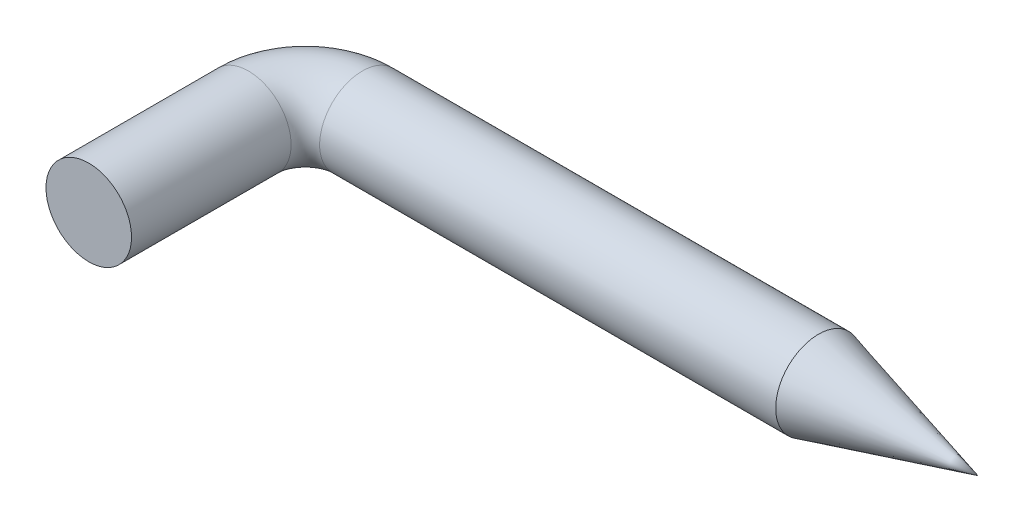
ISO-10303-21;
HEADER;
FILE_DESCRIPTION(('STEP AP214'),'2;1');
FILE_NAME('part.step','',(''),(''),'','','');
FILE_SCHEMA(('AUTOMOTIVE_DESIGN { 1 0 10303 214 1 1 1 1 }'));
ENDSEC;
DATA;
#1=APPLICATION_CONTEXT('core data for automotive mechanical design processes');
#2=APPLICATION_PROTOCOL_DEFINITION('international standard','automotive_design',2000,#1);
#3=PRODUCT_CONTEXT('',#1,'mechanical');
#4=PRODUCT('Part','Part','',(#3));
#5=PRODUCT_RELATED_PRODUCT_CATEGORY('part','',(#4));
#6=PRODUCT_DEFINITION_FORMATION('','',#4);
#7=PRODUCT_DEFINITION_CONTEXT('part definition',#1,'design');
#8=PRODUCT_DEFINITION('design','',#6,#7);
#9=PRODUCT_DEFINITION_SHAPE('','',#8);
#10=(LENGTH_UNIT() NAMED_UNIT(*) SI_UNIT(.MILLI.,.METRE.));
#11=(NAMED_UNIT(*) PLANE_ANGLE_UNIT() SI_UNIT($,.RADIAN.));
#12=(NAMED_UNIT(*) SI_UNIT($,.STERADIAN.) SOLID_ANGLE_UNIT());
#13=UNCERTAINTY_MEASURE_WITH_UNIT(LENGTH_MEASURE(1.E-05),#10,'distance_accuracy_value','');
#14=(GEOMETRIC_REPRESENTATION_CONTEXT(3) GLOBAL_UNCERTAINTY_ASSIGNED_CONTEXT((#13)) GLOBAL_UNIT_ASSIGNED_CONTEXT((#10,
#11,#12)) REPRESENTATION_CONTEXT('',''));
#15=CARTESIAN_POINT('',(0.,0.,0.));
#16=DIRECTION('',(0.,0.,1.));
#17=DIRECTION('',(1.,0.,0.));
#18=AXIS2_PLACEMENT_3D('',#15,#16,#17);
#19=CARTESIAN_POINT('',(0.,0.,0.));
#20=DIRECTION('',(0.,0.,1.));
#21=DIRECTION('',(1.,0.,0.));
#22=AXIS2_PLACEMENT_3D('',#19,#20,#21);
#23=PLANE('',#22);
#24=CARTESIAN_POINT('',(0.,0.,0.));
#25=DIRECTION('',(0.,0.,1.));
#26=DIRECTION('',(1.,0.,0.));
#27=AXIS2_PLACEMENT_3D('',#24,#25,#26);
#28=CIRCLE('',#27,7.5);
#29=CARTESIAN_POINT('',(7.5,0.,0.));
#30=VERTEX_POINT('',#29);
#31=EDGE_CURVE('E44',#30,#30,#28,.T.);
#32=ORIENTED_EDGE('',*,*,#31,.T.);
#33=EDGE_LOOP('',(#32));
#34=FACE_BOUND('',#33,.T.);
#35=ADVANCED_FACE('F32',(#34),#23,.T.);
#36=CARTESIAN_POINT('',(0.,0.,0.));
#37=DIRECTION('',(0.,0.,-1.));
#38=DIRECTION('',(-1.,0.,0.));
#39=AXIS2_PLACEMENT_3D('',#36,#37,#38);
#40=CYLINDRICAL_SURFACE('',#39,7.5);
#41=CARTESIAN_POINT('',(0.,0.,-28.));
#42=DIRECTION('',(0.,0.,1.));
#43=DIRECTION('',(1.,0.,0.));
#44=AXIS2_PLACEMENT_3D('',#41,#42,#43);
#45=CIRCLE('',#44,7.5);
#46=CARTESIAN_POINT('',(-7.5,0.,-28.));
#47=VERTEX_POINT('',#46);
#48=EDGE_CURVE('E39',#47,#47,#45,.T.);
#49=ORIENTED_EDGE('',*,*,#48,.T.);
#50=EDGE_LOOP('',(#49));
#51=FACE_BOUND('',#50,.T.);
#52=ORIENTED_EDGE('',*,*,#31,.F.);
#53=EDGE_LOOP('',(#52));
#54=FACE_BOUND('',#53,.T.);
#55=ADVANCED_FACE('F61',(#51,#54),#40,.T.);
#56=CARTESIAN_POINT('',(10.,0.,-28.));
#57=DIRECTION('',(0.,-1.,0.));
#58=DIRECTION('',(0.,0.,-1.));
#59=AXIS2_PLACEMENT_3D('',#56,#57,#58);
#60=TOROIDAL_SURFACE('',#59,10.,7.5);
#61=CARTESIAN_POINT('',(10.,0.,-38.));
#62=DIRECTION('',(-1.,0.,0.));
#63=DIRECTION('',(0.,0.,1.));
#64=AXIS2_PLACEMENT_3D('',#61,#62,#63);
#65=CIRCLE('',#64,7.5);
#66=CARTESIAN_POINT('',(10.,0.,-45.5));
#67=VERTEX_POINT('',#66);
#68=EDGE_CURVE('E11',#67,#67,#65,.T.);
#69=CARTESIAN_POINT('',(10.,0.,-28.));
#70=DIRECTION('',(0.,-1.,0.));
#71=DIRECTION('',(0.,0.,-1.));
#72=AXIS2_PLACEMENT_3D('',#69,#70,#71);
#73=CIRCLE('',#72,17.5);
#74=EDGE_CURVE('',#47,#67,#73,.T.);
#75=ORIENTED_EDGE('',*,*,#48,.F.);
#76=ORIENTED_EDGE('',*,*,#68,.T.);
#77=ORIENTED_EDGE('',*,*,#74,.T.);
#78=ORIENTED_EDGE('',*,*,#74,.F.);
#79=EDGE_LOOP('',(#75,#77,#76,#78));
#80=FACE_BOUND('',#79,.T.);
#81=ADVANCED_FACE('F63',(#80),#60,.T.);
#82=CARTESIAN_POINT('',(10.,0.,-38.));
#83=DIRECTION('',(1.,0.,0.));
#84=DIRECTION('',(0.,0.,-1.));
#85=AXIS2_PLACEMENT_3D('',#82,#83,#84);
#86=CYLINDRICAL_SURFACE('',#85,7.5);
#87=CARTESIAN_POINT('',(90.,0.,-38.));
#88=DIRECTION('',(1.,0.,0.));
#89=DIRECTION('',(0.,0.,-1.));
#90=AXIS2_PLACEMENT_3D('',#87,#88,#89);
#91=CIRCLE('',#90,7.5);
#92=CARTESIAN_POINT('',(90.,0.,-45.5));
#93=VERTEX_POINT('',#92);
#94=EDGE_CURVE('E54',#93,#93,#91,.T.);
#95=ORIENTED_EDGE('',*,*,#94,.F.);
#96=EDGE_LOOP('',(#95));
#97=FACE_BOUND('',#96,.T.);
#98=ORIENTED_EDGE('',*,*,#68,.F.);
#99=EDGE_LOOP('',(#98));
#100=FACE_BOUND('',#99,.T.);
#101=ADVANCED_FACE('F50',(#97,#100),#86,.T.);
#102=CARTESIAN_POINT('',(90.,0.,-38.));
#103=DIRECTION('',(-1.,0.,0.));
#104=DIRECTION('',(0.,0.,-1.));
#105=AXIS2_PLACEMENT_3D('',#102,#103,#104);
#106=CONICAL_SURFACE('',#105,7.5,0.261799387799149);
#107=CARTESIAN_POINT('',(117.990381056767,0.,-38.));
#108=VERTEX_POINT('',#107);
#109=VERTEX_LOOP('',#108);
#110=FACE_BOUND('',#109,.T.);
#111=ORIENTED_EDGE('',*,*,#94,.T.);
#112=EDGE_LOOP('',(#111));
#113=FACE_BOUND('',#112,.T.);
#114=ADVANCED_FACE('F47',(#110,#113),#106,.T.);
#115=CLOSED_SHELL('',(#35,#55,#81,#101,#114));
#116=MANIFOLD_SOLID_BREP('B2',#115);
#117=ADVANCED_BREP_SHAPE_REPRESENTATION('',(#18,#116),#14);
#118=SHAPE_DEFINITION_REPRESENTATION(#9,#117);
ENDSEC;
END-ISO-10303-21;
